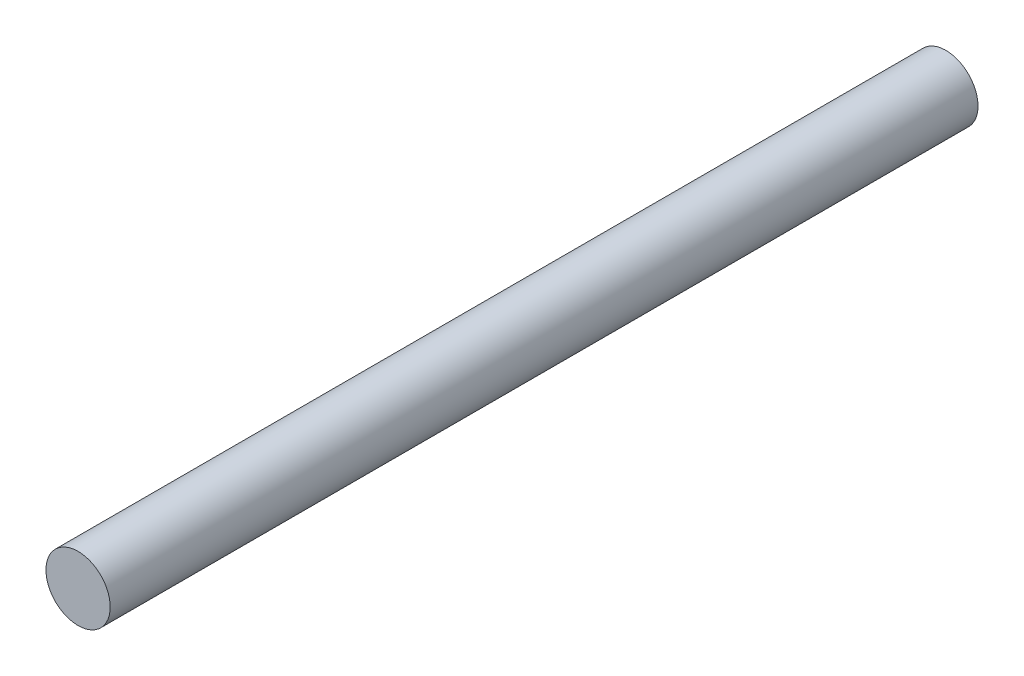
ISO-10303-21;
HEADER;
FILE_DESCRIPTION(('STEP AP214'),'2;1');
FILE_NAME('part.step','',(''),(''),'','','');
FILE_SCHEMA(('AUTOMOTIVE_DESIGN { 1 0 10303 214 1 1 1 1 }'));
ENDSEC;
DATA;
#1=APPLICATION_CONTEXT('core data for automotive mechanical design processes');
#2=APPLICATION_PROTOCOL_DEFINITION('international standard','automotive_design',2000,#1);
#3=PRODUCT_CONTEXT('',#1,'mechanical');
#4=PRODUCT('Part','Part','',(#3));
#5=PRODUCT_RELATED_PRODUCT_CATEGORY('part','',(#4));
#6=PRODUCT_DEFINITION_FORMATION('','',#4);
#7=PRODUCT_DEFINITION_CONTEXT('part definition',#1,'design');
#8=PRODUCT_DEFINITION('design','',#6,#7);
#9=PRODUCT_DEFINITION_SHAPE('','',#8);
#10=(LENGTH_UNIT() NAMED_UNIT(*) SI_UNIT(.MILLI.,.METRE.));
#11=(NAMED_UNIT(*) PLANE_ANGLE_UNIT() SI_UNIT($,.RADIAN.));
#12=(NAMED_UNIT(*) SI_UNIT($,.STERADIAN.) SOLID_ANGLE_UNIT());
#13=UNCERTAINTY_MEASURE_WITH_UNIT(LENGTH_MEASURE(1.E-05),#10,'distance_accuracy_value','');
#14=(GEOMETRIC_REPRESENTATION_CONTEXT(3) GLOBAL_UNCERTAINTY_ASSIGNED_CONTEXT((#13)) GLOBAL_UNIT_ASSIGNED_CONTEXT((#10,
#11,#12)) REPRESENTATION_CONTEXT('',''));
#15=CARTESIAN_POINT('',(0.,0.,0.));
#16=DIRECTION('',(0.,0.,1.));
#17=DIRECTION('',(1.,0.,0.));
#18=AXIS2_PLACEMENT_3D('',#15,#16,#17);
#19=CARTESIAN_POINT('',(0.,0.,135.));
#20=DIRECTION('',(0.,0.,-1.));
#21=DIRECTION('',(-1.,0.,0.));
#22=AXIS2_PLACEMENT_3D('',#19,#20,#21);
#23=CYLINDRICAL_SURFACE('',#22,5.);
#24=CARTESIAN_POINT('',(0.,0.,135.));
#25=DIRECTION('',(0.,0.,1.));
#26=DIRECTION('',(1.,0.,0.));
#27=AXIS2_PLACEMENT_3D('',#24,#25,#26);
#28=CIRCLE('',#27,5.);
#29=CARTESIAN_POINT('',(5.,0.,135.));
#30=VERTEX_POINT('',#29);
#31=EDGE_CURVE('E10',#30,#30,#28,.T.);
#32=ORIENTED_EDGE('',*,*,#31,.F.);
#33=EDGE_LOOP('',(#32));
#34=FACE_BOUND('',#33,.T.);
#35=CARTESIAN_POINT('',(0.,0.,0.));
#36=DIRECTION('',(0.,0.,1.));
#37=DIRECTION('',(1.,0.,0.));
#38=AXIS2_PLACEMENT_3D('',#35,#36,#37);
#39=CIRCLE('',#38,5.);
#40=CARTESIAN_POINT('',(5.,0.,0.));
#41=VERTEX_POINT('',#40);
#42=EDGE_CURVE('E40',#41,#41,#39,.T.);
#43=ORIENTED_EDGE('',*,*,#42,.T.);
#44=EDGE_LOOP('',(#43));
#45=FACE_BOUND('',#44,.T.);
#46=ADVANCED_FACE('F37',(#34,#45),#23,.T.);
#47=CARTESIAN_POINT('',(0.,0.,135.));
#48=DIRECTION('',(0.,0.,1.));
#49=DIRECTION('',(1.,0.,0.));
#50=AXIS2_PLACEMENT_3D('',#47,#48,#49);
#51=PLANE('',#50);
#52=ORIENTED_EDGE('',*,*,#31,.T.);
#53=EDGE_LOOP('',(#52));
#54=FACE_BOUND('',#53,.T.);
#55=ADVANCED_FACE('F52',(#54),#51,.T.);
#56=CARTESIAN_POINT('',(0.,0.,0.));
#57=DIRECTION('',(0.,0.,1.));
#58=DIRECTION('',(1.,0.,0.));
#59=AXIS2_PLACEMENT_3D('',#56,#57,#58);
#60=PLANE('',#59);
#61=ORIENTED_EDGE('',*,*,#42,.F.);
#62=EDGE_LOOP('',(#61));
#63=FACE_BOUND('',#62,.T.);
#64=ADVANCED_FACE('F50',(#63),#60,.F.);
#65=CLOSED_SHELL('',(#46,#55,#64));
#66=MANIFOLD_SOLID_BREP('B2',#65);
#67=ADVANCED_BREP_SHAPE_REPRESENTATION('',(#18,#66),#14);
#68=SHAPE_DEFINITION_REPRESENTATION(#9,#67);
ENDSEC;
END-ISO-10303-21;
